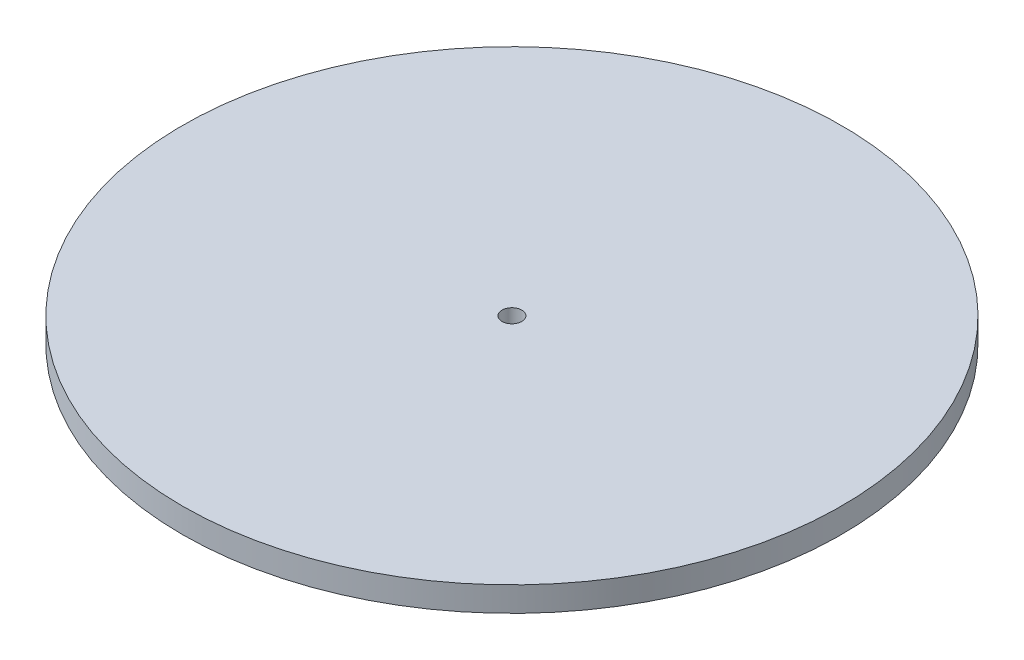
ISO-10303-21;
HEADER;
FILE_DESCRIPTION(('STEP AP214'),'2;1');
FILE_NAME('part.step','',(''),(''),'','','');
FILE_SCHEMA(('AUTOMOTIVE_DESIGN { 1 0 10303 214 1 1 1 1 }'));
ENDSEC;
DATA;
#1=APPLICATION_CONTEXT('core data for automotive mechanical design processes');
#2=APPLICATION_PROTOCOL_DEFINITION('international standard','automotive_design',2000,#1);
#3=PRODUCT_CONTEXT('',#1,'mechanical');
#4=PRODUCT('Part','Part','',(#3));
#5=PRODUCT_RELATED_PRODUCT_CATEGORY('part','',(#4));
#6=PRODUCT_DEFINITION_FORMATION('','',#4);
#7=PRODUCT_DEFINITION_CONTEXT('part definition',#1,'design');
#8=PRODUCT_DEFINITION('design','',#6,#7);
#9=PRODUCT_DEFINITION_SHAPE('','',#8);
#10=(LENGTH_UNIT() NAMED_UNIT(*) SI_UNIT(.MILLI.,.METRE.));
#11=(NAMED_UNIT(*) PLANE_ANGLE_UNIT() SI_UNIT($,.RADIAN.));
#12=(NAMED_UNIT(*) SI_UNIT($,.STERADIAN.) SOLID_ANGLE_UNIT());
#13=UNCERTAINTY_MEASURE_WITH_UNIT(LENGTH_MEASURE(1.E-05),#10,'distance_accuracy_value','');
#14=(GEOMETRIC_REPRESENTATION_CONTEXT(3) GLOBAL_UNCERTAINTY_ASSIGNED_CONTEXT((#13)) GLOBAL_UNIT_ASSIGNED_CONTEXT((#10,
#11,#12)) REPRESENTATION_CONTEXT('',''));
#15=CARTESIAN_POINT('',(0.,0.,0.));
#16=DIRECTION('',(0.,0.,1.));
#17=DIRECTION('',(1.,0.,0.));
#18=AXIS2_PLACEMENT_3D('',#15,#16,#17);
#19=CARTESIAN_POINT('',(0.,26.1736885021,0.));
#20=DIRECTION('',(0.,1.,0.));
#21=DIRECTION('',(0.,0.,1.));
#22=AXIS2_PLACEMENT_3D('',#19,#20,#21);
#23=CYLINDRICAL_SURFACE('',#22,40.);
#24=CARTESIAN_POINT('',(0.,26.1736885021,0.));
#25=DIRECTION('',(0.,1.,0.));
#26=DIRECTION('',(0.,0.,1.));
#27=AXIS2_PLACEMENT_3D('',#24,#25,#26);
#28=CIRCLE('',#27,40.);
#29=CARTESIAN_POINT('',(0.,26.1736885021,40.));
#30=VERTEX_POINT('',#29);
#31=EDGE_CURVE('E49',#30,#30,#28,.T.);
#32=ORIENTED_EDGE('',*,*,#31,.F.);
#33=EDGE_LOOP('',(#32));
#34=FACE_BOUND('',#33,.T.);
#35=CARTESIAN_POINT('',(0.,23.1736885021,0.));
#36=DIRECTION('',(0.,1.,0.));
#37=DIRECTION('',(0.,0.,1.));
#38=AXIS2_PLACEMENT_3D('',#35,#36,#37);
#39=CIRCLE('',#38,40.);
#40=CARTESIAN_POINT('',(0.,23.1736885021,40.));
#41=VERTEX_POINT('',#40);
#42=EDGE_CURVE('E10',#41,#41,#39,.T.);
#43=ORIENTED_EDGE('',*,*,#42,.T.);
#44=EDGE_LOOP('',(#43));
#45=FACE_BOUND('',#44,.T.);
#46=ADVANCED_FACE('F30',(#34,#45),#23,.T.);
#47=CARTESIAN_POINT('',(37.,23.1736885021,0.));
#48=DIRECTION('',(0.,1.,0.));
#49=DIRECTION('',(0.,0.,1.));
#50=AXIS2_PLACEMENT_3D('',#47,#48,#49);
#51=PLANE('',#50);
#52=ORIENTED_EDGE('',*,*,#42,.F.);
#53=EDGE_LOOP('',(#52));
#54=FACE_BOUND('',#53,.T.);
#55=CARTESIAN_POINT('',(0.,23.1736885021,0.));
#56=DIRECTION('',(0.,1.,0.));
#57=DIRECTION('',(0.,0.,1.));
#58=AXIS2_PLACEMENT_3D('',#55,#56,#57);
#59=CIRCLE('',#58,37.);
#60=CARTESIAN_POINT('',(0.,23.1736885021,37.));
#61=VERTEX_POINT('',#60);
#62=EDGE_CURVE('E36',#61,#61,#59,.T.);
#63=ORIENTED_EDGE('',*,*,#62,.T.);
#64=EDGE_LOOP('',(#63));
#65=FACE_BOUND('',#64,.T.);
#66=ADVANCED_FACE('F70',(#54,#65),#51,.F.);
#67=CARTESIAN_POINT('',(0.,26.1736885021,0.));
#68=DIRECTION('',(0.,1.,0.));
#69=DIRECTION('',(0.,0.,1.));
#70=AXIS2_PLACEMENT_3D('',#67,#68,#69);
#71=CYLINDRICAL_SURFACE('',#70,37.0000000001052);
#72=ORIENTED_EDGE('',*,*,#62,.F.);
#73=EDGE_LOOP('',(#72));
#74=FACE_BOUND('',#73,.T.);
#75=CARTESIAN_POINT('',(0.,22.1736885022178,0.));
#76=DIRECTION('',(0.,1.,0.));
#77=DIRECTION('',(0.,0.,1.));
#78=AXIS2_PLACEMENT_3D('',#75,#76,#77);
#79=CIRCLE('',#78,37.0000000002104);
#80=CARTESIAN_POINT('',(0.,22.1736885022178,37.0000000002104));
#81=VERTEX_POINT('',#80);
#82=EDGE_CURVE('E40',#81,#81,#79,.T.);
#83=ORIENTED_EDGE('',*,*,#82,.T.);
#84=EDGE_LOOP('',(#83));
#85=FACE_BOUND('',#84,.T.);
#86=ADVANCED_FACE('F66',(#74,#85),#71,.T.);
#87=CARTESIAN_POINT('',(1.12919656264365E-12,0.,0.));
#88=CARTESIAN_POINT('',(4.62500002988936,0.363539266127926,0.));
#89=CARTESIAN_POINT('',(9.24999997567559,7.50933017716335,0.));
#90=CARTESIAN_POINT('',(13.8750000271529,6.13185873150004,0.));
#91=CARTESIAN_POINT('',(18.4999999685347,13.6328381454842,0.));
#92=CARTESIAN_POINT('',(23.1250000083694,13.1942565879769,0.));
#93=CARTESIAN_POINT('',(27.7499999880159,17.609451872861,0.));
#94=CARTESIAN_POINT('',(32.3749999979314,19.5836526914531,0.));
#95=CARTESIAN_POINT('',(37.0000000002104,22.1736885022178,0.));
#96=B_SPLINE_CURVE_WITH_KNOTS('',8,(#87,#88,#89,#90,#91,#92,#93,#94,#95),.UNSPECIFIED.,.F.,.F.,
(9,9),(0.0752757822667037,0.918512168470413),.UNSPECIFIED.);
#97=CARTESIAN_POINT('',(0.,26.1736885021,0.));
#98=DIRECTION('',(0.,1.,0.));
#99=AXIS1_PLACEMENT('',#97,#98);
#100=SURFACE_OF_REVOLUTION('',#96,#99);
#101=CARTESIAN_POINT('',(0.,0.26723866016273,0.));
#102=DIRECTION('',(0.,1.,0.));
#103=DIRECTION('',(0.,0.,1.));
#104=AXIS2_PLACEMENT_3D('',#101,#102,#103);
#105=CIRCLE('',#104,1.2);
#106=CARTESIAN_POINT('',(0.,0.26723866016273,1.2));
#107=VERTEX_POINT('',#106);
#108=EDGE_CURVE('E52',#107,#107,#105,.T.);
#109=ORIENTED_EDGE('',*,*,#108,.T.);
#110=EDGE_LOOP('',(#109));
#111=FACE_BOUND('',#110,.T.);
#112=ORIENTED_EDGE('',*,*,#82,.F.);
#113=EDGE_LOOP('',(#112));
#114=FACE_BOUND('',#113,.T.);
#115=ADVANCED_FACE('F61',(#111,#114),#100,.T.);
#116=CARTESIAN_POINT('',(0.,26.1736885021,0.));
#117=DIRECTION('',(0.,1.,0.));
#118=DIRECTION('',(0.,0.,1.));
#119=AXIS2_PLACEMENT_3D('',#116,#117,#118);
#120=CYLINDRICAL_SURFACE('',#119,1.2);
#121=CARTESIAN_POINT('',(0.,26.1736885021,0.));
#122=DIRECTION('',(0.,1.,0.));
#123=DIRECTION('',(0.,0.,1.));
#124=AXIS2_PLACEMENT_3D('',#121,#122,#123);
#125=CIRCLE('',#124,1.2);
#126=CARTESIAN_POINT('',(0.,26.1736885021,1.2));
#127=VERTEX_POINT('',#126);
#128=EDGE_CURVE('E44',#127,#127,#125,.T.);
#129=ORIENTED_EDGE('',*,*,#128,.T.);
#130=EDGE_LOOP('',(#129));
#131=FACE_BOUND('',#130,.T.);
#132=ORIENTED_EDGE('',*,*,#108,.F.);
#133=EDGE_LOOP('',(#132));
#134=FACE_BOUND('',#133,.T.);
#135=ADVANCED_FACE('F65',(#131,#134),#120,.F.);
#136=CARTESIAN_POINT('',(40.,26.1736885021,0.));
#137=DIRECTION('',(0.,-1.,0.));
#138=DIRECTION('',(0.,0.,-1.));
#139=AXIS2_PLACEMENT_3D('',#136,#137,#138);
#140=PLANE('',#139);
#141=ORIENTED_EDGE('',*,*,#128,.F.);
#142=EDGE_LOOP('',(#141));
#143=FACE_BOUND('',#142,.T.);
#144=ORIENTED_EDGE('',*,*,#31,.T.);
#145=EDGE_LOOP('',(#144));
#146=FACE_BOUND('',#145,.T.);
#147=ADVANCED_FACE('F82',(#143,#146),#140,.F.);
#148=CLOSED_SHELL('',(#46,#66,#86,#115,#135,#147));
#149=MANIFOLD_SOLID_BREP('B2',#148);
#150=ADVANCED_BREP_SHAPE_REPRESENTATION('',(#18,#149),#14);
#151=SHAPE_DEFINITION_REPRESENTATION(#9,#150);
ENDSEC;
END-ISO-10303-21;
